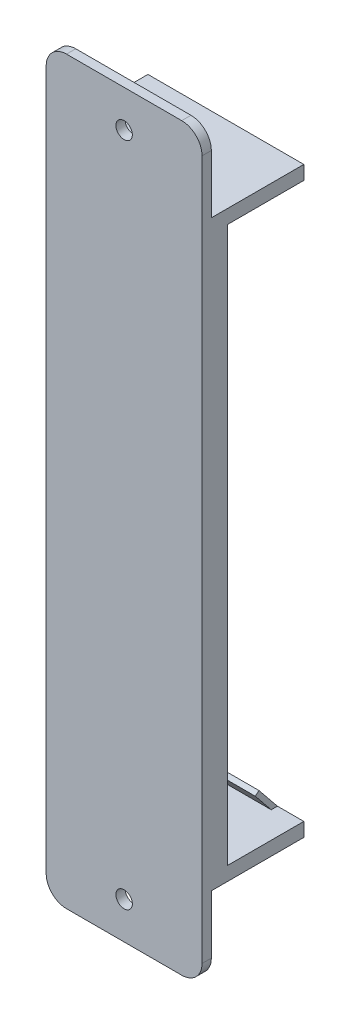
ISO-10303-21;
HEADER;
FILE_DESCRIPTION(('STEP AP214'),'2;1');
FILE_NAME('part.step','',(''),(''),'','','');
FILE_SCHEMA(('AUTOMOTIVE_DESIGN { 1 0 10303 214 1 1 1 1 }'));
ENDSEC;
DATA;
#1=APPLICATION_CONTEXT('core data for automotive mechanical design processes');
#2=APPLICATION_PROTOCOL_DEFINITION('international standard','automotive_design',2000,#1);
#3=PRODUCT_CONTEXT('',#1,'mechanical');
#4=PRODUCT('Part','Part','',(#3));
#5=PRODUCT_RELATED_PRODUCT_CATEGORY('part','',(#4));
#6=PRODUCT_DEFINITION_FORMATION('','',#4);
#7=PRODUCT_DEFINITION_CONTEXT('part definition',#1,'design');
#8=PRODUCT_DEFINITION('design','',#6,#7);
#9=PRODUCT_DEFINITION_SHAPE('','',#8);
#10=(LENGTH_UNIT() NAMED_UNIT(*) SI_UNIT(.MILLI.,.METRE.));
#11=(NAMED_UNIT(*) PLANE_ANGLE_UNIT() SI_UNIT($,.RADIAN.));
#12=(NAMED_UNIT(*) SI_UNIT($,.STERADIAN.) SOLID_ANGLE_UNIT());
#13=UNCERTAINTY_MEASURE_WITH_UNIT(LENGTH_MEASURE(1.E-05),#10,'distance_accuracy_value','');
#14=(GEOMETRIC_REPRESENTATION_CONTEXT(3) GLOBAL_UNCERTAINTY_ASSIGNED_CONTEXT((#13)) GLOBAL_UNIT_ASSIGNED_CONTEXT((#10,
#11,#12)) REPRESENTATION_CONTEXT('',''));
#15=CARTESIAN_POINT('',(0.,0.,0.));
#16=DIRECTION('',(0.,0.,1.));
#17=DIRECTION('',(1.,0.,0.));
#18=AXIS2_PLACEMENT_3D('',#15,#16,#17);
#19=CARTESIAN_POINT('',(-10.700385,12.7,0.));
#20=DIRECTION('',(1.,0.,0.));
#21=DIRECTION('',(0.,0.,-1.));
#22=AXIS2_PLACEMENT_3D('',#19,#20,#21);
#23=PLANE('',#22);
#24=DIRECTION('',(0.,-1.,0.));
#25=VECTOR('',#24,1.);
#26=CARTESIAN_POINT('',(-10.700385,12.7,10.700385));
#27=LINE('',#26,#25);
#28=CARTESIAN_POINT('',(-10.700385,-78.105,10.700385));
#29=VERTEX_POINT('',#28);
#30=CARTESIAN_POINT('',(-10.700385,-86.106,10.700385));
#31=VERTEX_POINT('',#30);
#32=EDGE_CURVE('E451',#29,#31,#27,.T.);
#33=ORIENTED_EDGE('',*,*,#32,.T.);
#34=DIRECTION('',(0.,0.,1.));
#35=VECTOR('',#34,1.);
#36=CARTESIAN_POINT('',(-10.700385,-86.106,0.));
#37=LINE('',#36,#35);
#38=CARTESIAN_POINT('',(-10.700385,-86.106,11.970385));
#39=VERTEX_POINT('',#38);
#40=EDGE_CURVE('E472',#31,#39,#37,.T.);
#41=ORIENTED_EDGE('',*,*,#40,.T.);
#42=DIRECTION('',(0.,-1.,0.));
#43=VECTOR('',#42,1.);
#44=CARTESIAN_POINT('',(-10.700385,12.7,11.970385));
#45=LINE('',#44,#43);
#46=CARTESIAN_POINT('',(-10.700385,9.906,11.970385));
#47=VERTEX_POINT('',#46);
#48=EDGE_CURVE('E447',#47,#39,#45,.T.);
#49=ORIENTED_EDGE('',*,*,#48,.F.);
#50=DIRECTION('',(0.,0.,1.));
#51=VECTOR('',#50,1.);
#52=CARTESIAN_POINT('',(-10.700385,9.906,10.700385));
#53=LINE('',#52,#51);
#54=CARTESIAN_POINT('',(-10.700385,9.906,10.700385));
#55=VERTEX_POINT('',#54);
#56=EDGE_CURVE('E463',#47,#55,#53,.F.);
#57=ORIENTED_EDGE('',*,*,#56,.T.);
#58=CARTESIAN_POINT('',(-10.700385,1.905,10.700385));
#59=VERTEX_POINT('',#58);
#60=EDGE_CURVE('E452',#55,#59,#27,.T.);
#61=ORIENTED_EDGE('',*,*,#60,.T.);
#62=DIRECTION('',(0.,0.,1.));
#63=VECTOR('',#62,1.);
#64=CARTESIAN_POINT('',(-10.700385,1.905,-1.999615));
#65=LINE('',#64,#63);
#66=CARTESIAN_POINT('',(-10.700385,1.905,-1.999615));
#67=VERTEX_POINT('',#66);
#68=EDGE_CURVE('E385',#67,#59,#65,.T.);
#69=ORIENTED_EDGE('',*,*,#68,.F.);
#70=DIRECTION('',(0.,1.,0.));
#71=VECTOR('',#70,1.);
#72=CARTESIAN_POINT('',(-10.700385,0.,-1.999615));
#73=LINE('',#72,#71);
#74=CARTESIAN_POINT('',(-10.700385,0.,-1.999615));
#75=VERTEX_POINT('',#74);
#76=EDGE_CURVE('E372',#75,#67,#73,.T.);
#77=ORIENTED_EDGE('',*,*,#76,.F.);
#78=DIRECTION('',(0.,0.,1.));
#79=VECTOR('',#78,1.);
#80=CARTESIAN_POINT('',(-10.700385,0.,-1.999615));
#81=LINE('',#80,#79);
#82=CARTESIAN_POINT('',(-10.700385,0.,8.45971601406342));
#83=VERTEX_POINT('',#82);
#84=EDGE_CURVE('E389',#75,#83,#81,.T.);
#85=ORIENTED_EDGE('',*,*,#84,.T.);
#86=DIRECTION('',(0.,1.,0.));
#87=VECTOR('',#86,1.);
#88=CARTESIAN_POINT('',(-10.700385,-76.2,8.45971601406342));
#89=LINE('',#88,#87);
#90=CARTESIAN_POINT('',(-10.700385,-76.2,8.45971601406342));
#91=VERTEX_POINT('',#90);
#92=EDGE_CURVE('E427',#91,#83,#89,.T.);
#93=ORIENTED_EDGE('',*,*,#92,.F.);
#94=DIRECTION('',(0.,0.,1.));
#95=VECTOR('',#94,1.);
#96=CARTESIAN_POINT('',(-10.700385,-76.2,-1.999615));
#97=LINE('',#96,#95);
#98=CARTESIAN_POINT('',(-10.700385,-76.2,-1.999615));
#99=VERTEX_POINT('',#98);
#100=EDGE_CURVE('E354',#99,#91,#97,.T.);
#101=ORIENTED_EDGE('',*,*,#100,.F.);
#102=DIRECTION('',(0.,1.,0.));
#103=VECTOR('',#102,1.);
#104=CARTESIAN_POINT('',(-10.700385,-76.2,-1.999615));
#105=LINE('',#104,#103);
#106=CARTESIAN_POINT('',(-10.700385,-78.105,-1.999615));
#107=VERTEX_POINT('',#106);
#108=EDGE_CURVE('E341',#107,#99,#105,.T.);
#109=ORIENTED_EDGE('',*,*,#108,.F.);
#110=DIRECTION('',(0.,0.,1.));
#111=VECTOR('',#110,1.);
#112=CARTESIAN_POINT('',(-10.700385,-78.105,-1.999615));
#113=LINE('',#112,#111);
#114=EDGE_CURVE('E357',#107,#29,#113,.T.);
#115=ORIENTED_EDGE('',*,*,#114,.T.);
#116=EDGE_LOOP('',(#33,#41,#49,#57,#61,#69,#77,#85,#93,#101,#109,#115));
#117=FACE_BOUND('',#116,.T.);
#118=ADVANCED_FACE('F77',(#117),#23,.F.);
#119=CARTESIAN_POINT('',(7.079615,-29.6007715383817,36.5717491689065));
#120=DIRECTION('',(0.,0.629134924444677,-0.777296112716377));
#121=DIRECTION('',(0.,0.777296112716377,0.629134924444677));
#122=AXIS2_PLACEMENT_3D('',#119,#120,#121);
#123=PLANE('',#122);
#124=DIRECTION('',(0.,-0.777296112716377,-0.629134924444677));
#125=VECTOR('',#124,1.);
#126=CARTESIAN_POINT('',(-7.144385,-29.6007715383817,36.5717491689065));
#127=LINE('',#126,#125);
#128=CARTESIAN_POINT('',(-7.144385,-73.4918648603631,1.04678097574282));
#129=VERTEX_POINT('',#128);
#130=CARTESIAN_POINT('',(-7.144385,-76.2,-1.14515382051818));
#131=VERTEX_POINT('',#130);
#132=EDGE_CURVE('E257',#129,#131,#127,.T.);
#133=ORIENTED_EDGE('',*,*,#132,.T.);
#134=DIRECTION('',(-1.,0.,0.));
#135=VECTOR('',#134,1.);
#136=CARTESIAN_POINT('',(7.079615,-76.2,-1.14515382051818));
#137=LINE('',#136,#135);
#138=CARTESIAN_POINT('',(7.079615,-76.2,-1.14515382051818));
#139=VERTEX_POINT('',#138);
#140=EDGE_CURVE('E278',#139,#131,#137,.T.);
#141=ORIENTED_EDGE('',*,*,#140,.F.);
#142=DIRECTION('',(0.,-0.777296112716377,-0.629134924444677));
#143=VECTOR('',#142,1.);
#144=CARTESIAN_POINT('',(7.079615,-29.6007715383817,36.5717491689065));
#145=LINE('',#144,#143);
#146=CARTESIAN_POINT('',(7.079615,-73.4918648603631,1.04678097574282));
#147=VERTEX_POINT('',#146);
#148=EDGE_CURVE('E578',#147,#139,#145,.T.);
#149=ORIENTED_EDGE('',*,*,#148,.F.);
#150=DIRECTION('',(-1.,0.,0.));
#151=VECTOR('',#150,1.);
#152=CARTESIAN_POINT('',(7.079615,-73.4918648603631,1.04678097574282));
#153=LINE('',#152,#151);
#154=EDGE_CURVE('E279',#147,#129,#153,.T.);
#155=ORIENTED_EDGE('',*,*,#154,.T.);
#156=EDGE_LOOP('',(#133,#141,#149,#155));
#157=FACE_BOUND('',#156,.T.);
#158=ADVANCED_FACE('F593',(#157),#123,.F.);
#159=CARTESIAN_POINT('',(7.079615,-29.1829194024886,36.055492912418));
#160=DIRECTION('',(0.,-0.629134924444678,0.777296112716376));
#161=DIRECTION('',(0.,-0.777296112716376,-0.629134924444678));
#162=AXIS2_PLACEMENT_3D('',#159,#160,#161);
#163=PLANE('',#162);
#164=DIRECTION('',(0.,0.777296112716376,0.629134924444678));
#165=VECTOR('',#164,1.);
#166=CARTESIAN_POINT('',(-7.144385,-29.1829194024886,36.055492912418));
#167=LINE('',#166,#165);
#168=CARTESIAN_POINT('',(-7.144385,-76.2,-1.999615));
#169=VERTEX_POINT('',#168);
#170=CARTESIAN_POINT('',(-7.144385,-73.0740127244699,0.530524719254272));
#171=VERTEX_POINT('',#170);
#172=EDGE_CURVE('E254',#169,#171,#167,.T.);
#173=ORIENTED_EDGE('',*,*,#172,.T.);
#174=DIRECTION('',(-1.,0.,0.));
#175=VECTOR('',#174,1.);
#176=CARTESIAN_POINT('',(7.079615,-73.0740127244699,0.530524719254272));
#177=LINE('',#176,#175);
#178=CARTESIAN_POINT('',(7.079615,-73.0740127244699,0.530524719254272));
#179=VERTEX_POINT('',#178);
#180=EDGE_CURVE('E268',#179,#171,#177,.T.);
#181=ORIENTED_EDGE('',*,*,#180,.F.);
#182=DIRECTION('',(0.,0.777296112716376,0.629134924444678));
#183=VECTOR('',#182,1.);
#184=CARTESIAN_POINT('',(7.079615,-29.1829194024886,36.055492912418));
#185=LINE('',#184,#183);
#186=CARTESIAN_POINT('',(7.079615,-76.2,-1.999615));
#187=VERTEX_POINT('',#186);
#188=EDGE_CURVE('E585',#187,#179,#185,.T.);
#189=ORIENTED_EDGE('',*,*,#188,.F.);
#190=DIRECTION('',(1.,0.,0.));
#191=VECTOR('',#190,1.);
#192=CARTESIAN_POINT('',(10.700385,-76.2,-1.999615));
#193=LINE('',#192,#191);
#194=EDGE_CURVE('E270',#169,#187,#193,.T.);
#195=ORIENTED_EDGE('',*,*,#194,.F.);
#196=EDGE_LOOP('',(#173,#181,#189,#195));
#197=FACE_BOUND('',#196,.T.);
#198=ADVANCED_FACE('F266',(#197),#163,.F.);
#199=CARTESIAN_POINT('',(7.079615,-43.8910933219814,-35.5249681931637));
#200=DIRECTION('',(0.,-0.777296112716376,-0.629134924444678));
#201=DIRECTION('',(0.,0.629134924444678,-0.777296112716376));
#202=AXIS2_PLACEMENT_3D('',#199,#200,#201);
#203=PLANE('',#202);
#204=DIRECTION('',(0.,-0.629134924444678,0.777296112716376));
#205=VECTOR('',#204,1.);
#206=CARTESIAN_POINT('',(-7.144385,-43.8910933219814,-35.5249681931637));
#207=LINE('',#206,#205);
#208=EDGE_CURVE('E251',#171,#129,#207,.T.);
#209=ORIENTED_EDGE('',*,*,#208,.T.);
#210=ORIENTED_EDGE('',*,*,#154,.F.);
#211=DIRECTION('',(0.,-0.629134924444678,0.777296112716376));
#212=VECTOR('',#211,1.);
#213=CARTESIAN_POINT('',(7.079615,-43.8910933219814,-35.5249681931637));
#214=LINE('',#213,#212);
#215=EDGE_CURVE('E276',#179,#147,#214,.T.);
#216=ORIENTED_EDGE('',*,*,#215,.F.);
#217=ORIENTED_EDGE('',*,*,#180,.T.);
#218=EDGE_LOOP('',(#209,#210,#216,#217));
#219=FACE_BOUND('',#218,.T.);
#220=ADVANCED_FACE('F275',(#219),#203,.F.);
#221=CARTESIAN_POINT('',(10.700385,-76.2,-1.999615));
#222=DIRECTION('',(0.,-1.,0.));
#223=DIRECTION('',(0.,0.,-1.));
#224=AXIS2_PLACEMENT_3D('',#221,#222,#223);
#225=PLANE('',#224);
#226=ORIENTED_EDGE('',*,*,#140,.T.);
#227=DIRECTION('',(0.,0.,-1.));
#228=VECTOR('',#227,1.);
#229=CARTESIAN_POINT('',(-7.144385,-76.2,0.));
#230=LINE('',#229,#228);
#231=EDGE_CURVE('E273',#131,#169,#230,.T.);
#232=ORIENTED_EDGE('',*,*,#231,.T.);
#233=EDGE_CURVE('E346',#99,#169,#193,.T.);
#234=ORIENTED_EDGE('',*,*,#233,.F.);
#235=ORIENTED_EDGE('',*,*,#100,.T.);
#236=DIRECTION('',(-1.,0.,0.));
#237=VECTOR('',#236,1.);
#238=CARTESIAN_POINT('',(0.,-76.2,8.45971601406342));
#239=LINE('',#238,#237);
#240=CARTESIAN_POINT('',(-6.55220910148813,-76.2,8.45971601406342));
#241=VERTEX_POINT('',#240);
#242=EDGE_CURVE('E416',#241,#91,#239,.T.);
#243=ORIENTED_EDGE('',*,*,#242,.F.);
#244=CARTESIAN_POINT('',(0.,-76.2,0.));
#245=DIRECTION('',(0.,1.,0.));
#246=DIRECTION('',(0.,0.,1.));
#247=AXIS2_PLACEMENT_3D('',#244,#245,#246);
#248=CIRCLE('',#247,10.700385);
#249=CARTESIAN_POINT('',(6.55220910148813,-76.2,8.45971601406342));
#250=VERTEX_POINT('',#249);
#251=EDGE_CURVE('E413',#241,#250,#248,.T.);
#252=ORIENTED_EDGE('',*,*,#251,.T.);
#253=DIRECTION('',(-1.,0.,0.));
#254=VECTOR('',#253,1.);
#255=CARTESIAN_POINT('',(0.,-76.2,8.45971601406342));
#256=LINE('',#255,#254);
#257=CARTESIAN_POINT('',(10.700385,-76.2,8.45971601406342));
#258=VERTEX_POINT('',#257);
#259=EDGE_CURVE('E396',#258,#250,#256,.T.);
#260=ORIENTED_EDGE('',*,*,#259,.F.);
#261=DIRECTION('',(0.,0.,1.));
#262=VECTOR('',#261,1.);
#263=CARTESIAN_POINT('',(10.700385,-76.2,-1.999615));
#264=LINE('',#263,#262);
#265=CARTESIAN_POINT('',(10.700385,-76.2,-1.999615));
#266=VERTEX_POINT('',#265);
#267=EDGE_CURVE('E349',#266,#258,#264,.T.);
#268=ORIENTED_EDGE('',*,*,#267,.F.);
#269=EDGE_CURVE('E345',#187,#266,#193,.T.);
#270=ORIENTED_EDGE('',*,*,#269,.F.);
#271=DIRECTION('',(0.,0.,-1.));
#272=VECTOR('',#271,1.);
#273=CARTESIAN_POINT('',(7.079615,-76.2,0.));
#274=LINE('',#273,#272);
#275=EDGE_CURVE('E286',#139,#187,#274,.T.);
#276=ORIENTED_EDGE('',*,*,#275,.F.);
#277=EDGE_LOOP('',(#226,#232,#234,#235,#243,#252,#260,#268,#270,#276));
#278=FACE_BOUND('',#277,.T.);
#279=ADVANCED_FACE('F568',(#278),#225,.F.);
#280=CARTESIAN_POINT('',(10.700385,12.7,0.));
#281=DIRECTION('',(-1.,0.,0.));
#282=DIRECTION('',(0.,0.,1.));
#283=AXIS2_PLACEMENT_3D('',#280,#281,#282);
#284=PLANE('',#283);
#285=DIRECTION('',(0.,-1.,0.));
#286=VECTOR('',#285,1.);
#287=CARTESIAN_POINT('',(10.700385,12.7,11.970385));
#288=LINE('',#287,#286);
#289=CARTESIAN_POINT('',(10.700385,9.906,11.970385));
#290=VERTEX_POINT('',#289);
#291=CARTESIAN_POINT('',(10.700385,-86.106,11.970385));
#292=VERTEX_POINT('',#291);
#293=EDGE_CURVE('E459',#290,#292,#288,.T.);
#294=ORIENTED_EDGE('',*,*,#293,.T.);
#295=DIRECTION('',(0.,0.,-1.));
#296=VECTOR('',#295,1.);
#297=CARTESIAN_POINT('',(10.700385,-86.106,0.));
#298=LINE('',#297,#296);
#299=CARTESIAN_POINT('',(10.700385,-86.106,10.700385));
#300=VERTEX_POINT('',#299);
#301=EDGE_CURVE('E503',#292,#300,#298,.T.);
#302=ORIENTED_EDGE('',*,*,#301,.T.);
#303=DIRECTION('',(0.,-1.,0.));
#304=VECTOR('',#303,1.);
#305=CARTESIAN_POINT('',(10.700385,12.7,10.700385));
#306=LINE('',#305,#304);
#307=CARTESIAN_POINT('',(10.700385,-78.105,10.700385));
#308=VERTEX_POINT('',#307);
#309=EDGE_CURVE('E455',#308,#300,#306,.T.);
#310=ORIENTED_EDGE('',*,*,#309,.F.);
#311=DIRECTION('',(0.,0.,1.));
#312=VECTOR('',#311,1.);
#313=CARTESIAN_POINT('',(10.700385,-78.105,-1.999615));
#314=LINE('',#313,#312);
#315=CARTESIAN_POINT('',(10.700385,-78.105,-1.999615));
#316=VERTEX_POINT('',#315);
#317=EDGE_CURVE('E361',#316,#308,#314,.T.);
#318=ORIENTED_EDGE('',*,*,#317,.F.);
#319=DIRECTION('',(0.,-1.,0.));
#320=VECTOR('',#319,1.);
#321=CARTESIAN_POINT('',(10.700385,-78.105,-1.999615));
#322=LINE('',#321,#320);
#323=EDGE_CURVE('E334',#266,#316,#322,.T.);
#324=ORIENTED_EDGE('',*,*,#323,.F.);
#325=ORIENTED_EDGE('',*,*,#267,.T.);
#326=DIRECTION('',(0.,1.,0.));
#327=VECTOR('',#326,1.);
#328=CARTESIAN_POINT('',(10.700385,-76.2,8.45971601406342));
#329=LINE('',#328,#327);
#330=CARTESIAN_POINT('',(10.700385,0.,8.45971601406342));
#331=VERTEX_POINT('',#330);
#332=EDGE_CURVE('E397',#258,#331,#329,.T.);
#333=ORIENTED_EDGE('',*,*,#332,.T.);
#334=DIRECTION('',(0.,0.,1.));
#335=VECTOR('',#334,1.);
#336=CARTESIAN_POINT('',(10.700385,0.,-1.999615));
#337=LINE('',#336,#335);
#338=CARTESIAN_POINT('',(10.700385,0.,-1.999615));
#339=VERTEX_POINT('',#338);
#340=EDGE_CURVE('E393',#339,#331,#337,.T.);
#341=ORIENTED_EDGE('',*,*,#340,.F.);
#342=DIRECTION('',(0.,-1.,0.));
#343=VECTOR('',#342,1.);
#344=CARTESIAN_POINT('',(10.700385,1.905,-1.999615));
#345=LINE('',#344,#343);
#346=CARTESIAN_POINT('',(10.700385,1.905,-1.999615));
#347=VERTEX_POINT('',#346);
#348=EDGE_CURVE('E365',#347,#339,#345,.T.);
#349=ORIENTED_EDGE('',*,*,#348,.F.);
#350=DIRECTION('',(0.,0.,1.));
#351=VECTOR('',#350,1.);
#352=CARTESIAN_POINT('',(10.700385,1.905,-1.999615));
#353=LINE('',#352,#351);
#354=CARTESIAN_POINT('',(10.700385,1.905,10.700385));
#355=VERTEX_POINT('',#354);
#356=EDGE_CURVE('E378',#347,#355,#353,.T.);
#357=ORIENTED_EDGE('',*,*,#356,.T.);
#358=CARTESIAN_POINT('',(10.700385,9.906,10.700385));
#359=VERTEX_POINT('',#358);
#360=EDGE_CURVE('E456',#359,#355,#306,.T.);
#361=ORIENTED_EDGE('',*,*,#360,.F.);
#362=DIRECTION('',(0.,0.,-1.));
#363=VECTOR('',#362,1.);
#364=CARTESIAN_POINT('',(10.700385,9.906,11.970385));
#365=LINE('',#364,#363);
#366=EDGE_CURVE('E500',#359,#290,#365,.F.);
#367=ORIENTED_EDGE('',*,*,#366,.T.);
#368=EDGE_LOOP('',(#294,#302,#310,#318,#324,#325,#333,#341,#349,#357,#361,#367));
#369=FACE_BOUND('',#368,.T.);
#370=ADVANCED_FACE('F518',(#369),#284,.F.);
#371=CARTESIAN_POINT('',(-7.079615,-0.340326639448789,-0.340326639448795));
#372=DIRECTION('',(0.,0.707106781186541,0.707106781186553));
#373=DIRECTION('',(0.,-0.707106781186554,0.707106781186541));
#374=AXIS2_PLACEMENT_3D('',#371,#372,#373);
#375=PLANE('',#374);
#376=DIRECTION('',(1.,0.,0.));
#377=VECTOR('',#376,1.);
#378=CARTESIAN_POINT('',(-7.079615,-2.65172736552564,1.97107408662802));
#379=LINE('',#378,#377);
#380=CARTESIAN_POINT('',(-7.079615,-2.65172736552564,1.97107408662802));
#381=VERTEX_POINT('',#380);
#382=CARTESIAN_POINT('',(7.144385,-2.65172736552564,1.97107408662802));
#383=VERTEX_POINT('',#382);
#384=EDGE_CURVE('E317',#381,#383,#379,.T.);
#385=ORIENTED_EDGE('',*,*,#384,.T.);
#386=DIRECTION('',(0.,-0.707106781186554,0.707106781186541));
#387=VECTOR('',#386,1.);
#388=CARTESIAN_POINT('',(7.144385,-0.340326639448789,-0.340326639448795));
#389=LINE('',#388,#387);
#390=CARTESIAN_POINT('',(7.144385,0.,-0.680653278897578));
#391=VERTEX_POINT('',#390);
#392=EDGE_CURVE('E284',#391,#383,#389,.T.);
#393=ORIENTED_EDGE('',*,*,#392,.F.);
#394=DIRECTION('',(1.,0.,0.));
#395=VECTOR('',#394,1.);
#396=CARTESIAN_POINT('',(-7.079615,0.,-0.680653278897578));
#397=LINE('',#396,#395);
#398=CARTESIAN_POINT('',(-7.079615,0.,-0.680653278897578));
#399=VERTEX_POINT('',#398);
#400=EDGE_CURVE('E318',#399,#391,#397,.T.);
#401=ORIENTED_EDGE('',*,*,#400,.F.);
#402=DIRECTION('',(0.,-0.707106781186554,0.707106781186541));
#403=VECTOR('',#402,1.);
#404=CARTESIAN_POINT('',(-7.079615,-0.340326639448789,-0.340326639448795));
#405=LINE('',#404,#403);
#406=EDGE_CURVE('E302',#399,#381,#405,.T.);
#407=ORIENTED_EDGE('',*,*,#406,.T.);
#408=EDGE_LOOP('',(#385,#393,#401,#407));
#409=FACE_BOUND('',#408,.T.);
#410=ADVANCED_FACE('F666',(#409),#375,.T.);
#411=CARTESIAN_POINT('',(-7.079615,-0.990876376660425,-0.990876376660442));
#412=DIRECTION('',(0.,0.707106781186541,0.707106781186553));
#413=DIRECTION('',(0.,-0.707106781186554,0.707106781186541));
#414=AXIS2_PLACEMENT_3D('',#411,#412,#413);
#415=PLANE('',#414);
#416=DIRECTION('',(0.,-0.707106781186554,0.707106781186541));
#417=VECTOR('',#416,1.);
#418=CARTESIAN_POINT('',(7.144385,-0.990876376660425,-0.990876376660442));
#419=LINE('',#418,#417);
#420=CARTESIAN_POINT('',(7.144385,0.,-1.98175275332085));
#421=VERTEX_POINT('',#420);
#422=CARTESIAN_POINT('',(7.144385,-3.18610750680663,1.20435475348573));
#423=VERTEX_POINT('',#422);
#424=EDGE_CURVE('E295',#421,#423,#419,.T.);
#425=ORIENTED_EDGE('',*,*,#424,.T.);
#426=DIRECTION('',(1.,0.,0.));
#427=VECTOR('',#426,1.);
#428=CARTESIAN_POINT('',(-7.079615,-3.18610750680663,1.20435475348573));
#429=LINE('',#428,#427);
#430=CARTESIAN_POINT('',(-7.079615,-3.18610750680663,1.20435475348573));
#431=VERTEX_POINT('',#430);
#432=EDGE_CURVE('E327',#431,#423,#429,.T.);
#433=ORIENTED_EDGE('',*,*,#432,.F.);
#434=DIRECTION('',(0.,-0.707106781186554,0.707106781186541));
#435=VECTOR('',#434,1.);
#436=CARTESIAN_POINT('',(-7.079615,-0.990876376660425,-0.990876376660442));
#437=LINE('',#436,#435);
#438=CARTESIAN_POINT('',(-7.079615,0.,-1.98175275332085));
#439=VERTEX_POINT('',#438);
#440=EDGE_CURVE('E310',#439,#431,#437,.T.);
#441=ORIENTED_EDGE('',*,*,#440,.F.);
#442=DIRECTION('',(1.,0.,0.));
#443=VECTOR('',#442,1.);
#444=CARTESIAN_POINT('',(-7.079615,0.,-1.98175275332085));
#445=LINE('',#444,#443);
#446=EDGE_CURVE('E323',#439,#421,#445,.T.);
#447=ORIENTED_EDGE('',*,*,#446,.T.);
#448=EDGE_LOOP('',(#425,#433,#441,#447));
#449=FACE_BOUND('',#448,.T.);
#450=ADVANCED_FACE('F669',(#449),#415,.F.);
#451=CARTESIAN_POINT('',(-7.079615,-2.70937968653158,1.88835553909776));
#452=DIRECTION('',(0.,-0.820398166769988,0.57179266168817));
#453=DIRECTION('',(0.,-0.57179266168817,-0.820398166769988));
#454=AXIS2_PLACEMENT_3D('',#451,#452,#453);
#455=PLANE('',#454);
#456=ORIENTED_EDGE('',*,*,#432,.T.);
#457=DIRECTION('',(0.,-0.57179266168817,-0.820398166769988));
#458=VECTOR('',#457,1.);
#459=CARTESIAN_POINT('',(7.144385,-2.70937968653158,1.88835553909776));
#460=LINE('',#459,#458);
#461=EDGE_CURVE('E292',#383,#423,#460,.T.);
#462=ORIENTED_EDGE('',*,*,#461,.F.);
#463=ORIENTED_EDGE('',*,*,#384,.F.);
#464=DIRECTION('',(0.,-0.57179266168817,-0.820398166769988));
#465=VECTOR('',#464,1.);
#466=CARTESIAN_POINT('',(-7.079615,-2.70937968653158,1.88835553909776));
#467=LINE('',#466,#465);
#468=EDGE_CURVE('E306',#381,#431,#467,.T.);
#469=ORIENTED_EDGE('',*,*,#468,.T.);
#470=EDGE_LOOP('',(#456,#462,#463,#469));
#471=FACE_BOUND('',#470,.T.);
#472=ADVANCED_FACE('F619',(#471),#455,.T.);
#473=CARTESIAN_POINT('',(0.,12.7,10.700385));
#474=DIRECTION('',(0.,0.,-1.));
#475=DIRECTION('',(-1.,0.,0.));
#476=AXIS2_PLACEMENT_3D('',#473,#474,#475);
#477=PLANE('',#476);
#478=CARTESIAN_POINT('',(0.,-83.82,10.700385));
#479=DIRECTION('',(0.,0.,-1.));
#480=DIRECTION('',(-1.,0.,0.));
#481=AXIS2_PLACEMENT_3D('',#478,#479,#480);
#482=CIRCLE('',#481,1.1303);
#483=CARTESIAN_POINT('',(-1.1303,-83.82,10.700385));
#484=VERTEX_POINT('',#483);
#485=EDGE_CURVE('E468',#484,#484,#482,.T.);
#486=ORIENTED_EDGE('',*,*,#485,.F.);
#487=EDGE_LOOP('',(#486));
#488=FACE_BOUND('',#487,.T.);
#489=DIRECTION('',(1.,0.,0.));
#490=VECTOR('',#489,1.);
#491=CARTESIAN_POINT('',(0.,-88.9,10.700385));
#492=LINE('',#491,#490);
#493=CARTESIAN_POINT('',(-7.906385,-88.9,10.700385));
#494=VERTEX_POINT('',#493);
#495=CARTESIAN_POINT('',(7.906385,-88.9,10.700385));
#496=VERTEX_POINT('',#495);
#497=EDGE_CURVE('E436',#494,#496,#492,.T.);
#498=ORIENTED_EDGE('',*,*,#497,.F.);
#499=CARTESIAN_POINT('',(-7.906385,-86.106,10.700385));
#500=DIRECTION('',(0.,0.,-1.));
#501=DIRECTION('',(-1.,0.,0.));
#502=AXIS2_PLACEMENT_3D('',#499,#500,#501);
#503=CIRCLE('',#502,2.794);
#504=EDGE_CURVE('E497',#494,#31,#503,.T.);
#505=ORIENTED_EDGE('',*,*,#504,.T.);
#506=ORIENTED_EDGE('',*,*,#32,.F.);
#507=DIRECTION('',(-1.,0.,0.));
#508=VECTOR('',#507,1.);
#509=CARTESIAN_POINT('',(-10.700385,-78.105,10.700385));
#510=LINE('',#509,#508);
#511=EDGE_CURVE('E322',#308,#29,#510,.T.);
#512=ORIENTED_EDGE('',*,*,#511,.F.);
#513=ORIENTED_EDGE('',*,*,#309,.T.);
#514=CARTESIAN_POINT('',(7.906385,-86.106,10.700385));
#515=DIRECTION('',(0.,0.,-1.));
#516=DIRECTION('',(-1.,0.,0.));
#517=AXIS2_PLACEMENT_3D('',#514,#515,#516);
#518=CIRCLE('',#517,2.794);
#519=EDGE_CURVE('E494',#300,#496,#518,.T.);
#520=ORIENTED_EDGE('',*,*,#519,.T.);
#521=EDGE_LOOP('',(#498,#505,#506,#512,#513,#520));
#522=FACE_BOUND('',#521,.T.);
#523=ADVANCED_FACE('F555',(#488,#522),#477,.T.);
#524=CARTESIAN_POINT('',(0.,7.62,10.700385));
#525=DIRECTION('',(0.,0.,-1.));
#526=DIRECTION('',(-1.,0.,0.));
#527=AXIS2_PLACEMENT_3D('',#524,#525,#526);
#528=CIRCLE('',#527,1.1303);
#529=CARTESIAN_POINT('',(-1.1303,7.62,10.700385));
#530=VERTEX_POINT('',#529);
#531=EDGE_CURVE('E469',#530,#530,#528,.T.);
#532=ORIENTED_EDGE('',*,*,#531,.F.);
#533=EDGE_LOOP('',(#532));
#534=FACE_BOUND('',#533,.T.);
#535=ORIENTED_EDGE('',*,*,#60,.F.);
#536=CARTESIAN_POINT('',(-7.906385,9.906,10.700385));
#537=DIRECTION('',(0.,0.,-1.));
#538=DIRECTION('',(-1.,0.,0.));
#539=AXIS2_PLACEMENT_3D('',#536,#537,#538);
#540=CIRCLE('',#539,2.794);
#541=CARTESIAN_POINT('',(-7.906385,12.7,10.700385));
#542=VERTEX_POINT('',#541);
#543=EDGE_CURVE('E12',#55,#542,#540,.T.);
#544=ORIENTED_EDGE('',*,*,#543,.T.);
#545=DIRECTION('',(1.,0.,0.));
#546=VECTOR('',#545,1.);
#547=CARTESIAN_POINT('',(0.,12.7,10.700385));
#548=LINE('',#547,#546);
#549=CARTESIAN_POINT('',(7.906385,12.7,10.700385));
#550=VERTEX_POINT('',#549);
#551=EDGE_CURVE('E444',#542,#550,#548,.T.);
#552=ORIENTED_EDGE('',*,*,#551,.T.);
#553=CARTESIAN_POINT('',(7.906385,9.906,10.700385));
#554=DIRECTION('',(0.,0.,-1.));
#555=DIRECTION('',(-1.,0.,0.));
#556=AXIS2_PLACEMENT_3D('',#553,#554,#555);
#557=CIRCLE('',#556,2.794);
#558=EDGE_CURVE('E86',#550,#359,#557,.T.);
#559=ORIENTED_EDGE('',*,*,#558,.T.);
#560=ORIENTED_EDGE('',*,*,#360,.T.);
#561=DIRECTION('',(1.,0.,0.));
#562=VECTOR('',#561,1.);
#563=CARTESIAN_POINT('',(-10.700385,1.905,10.700385));
#564=LINE('',#563,#562);
#565=EDGE_CURVE('E364',#59,#355,#564,.T.);
#566=ORIENTED_EDGE('',*,*,#565,.F.);
#567=EDGE_LOOP('',(#535,#544,#552,#559,#560,#566));
#568=FACE_BOUND('',#567,.T.);
#569=ADVANCED_FACE('F515',(#534,#568),#477,.T.);
#570=CARTESIAN_POINT('',(0.,12.7,11.970385));
#571=DIRECTION('',(0.,0.,-1.));
#572=DIRECTION('',(-1.,0.,0.));
#573=AXIS2_PLACEMENT_3D('',#570,#571,#572);
#574=PLANE('',#573);
#575=CARTESIAN_POINT('',(0.,7.62,11.970385));
#576=DIRECTION('',(0.,0.,-1.));
#577=DIRECTION('',(-1.,0.,0.));
#578=AXIS2_PLACEMENT_3D('',#575,#576,#577);
#579=CIRCLE('',#578,1.1303);
#580=CARTESIAN_POINT('',(-1.1303,7.62,11.970385));
#581=VERTEX_POINT('',#580);
#582=EDGE_CURVE('E464',#581,#581,#579,.T.);
#583=ORIENTED_EDGE('',*,*,#582,.T.);
#584=EDGE_LOOP('',(#583));
#585=FACE_BOUND('',#584,.T.);
#586=CARTESIAN_POINT('',(0.,-83.82,11.970385));
#587=DIRECTION('',(0.,0.,-1.));
#588=DIRECTION('',(-1.,0.,0.));
#589=AXIS2_PLACEMENT_3D('',#586,#587,#588);
#590=CIRCLE('',#589,1.1303);
#591=CARTESIAN_POINT('',(-1.1303,-83.82,11.970385));
#592=VERTEX_POINT('',#591);
#593=EDGE_CURVE('E595',#592,#592,#590,.T.);
#594=ORIENTED_EDGE('',*,*,#593,.T.);
#595=EDGE_LOOP('',(#594));
#596=FACE_BOUND('',#595,.T.);
#597=ORIENTED_EDGE('',*,*,#48,.T.);
#598=CARTESIAN_POINT('',(-7.906385,-86.106,11.970385));
#599=DIRECTION('',(0.,0.,-1.));
#600=DIRECTION('',(-1.,0.,0.));
#601=AXIS2_PLACEMENT_3D('',#598,#599,#600);
#602=CIRCLE('',#601,2.794);
#603=CARTESIAN_POINT('',(-7.906385,-88.9,11.970385));
#604=VERTEX_POINT('',#603);
#605=EDGE_CURVE('E485',#39,#604,#602,.F.);
#606=ORIENTED_EDGE('',*,*,#605,.T.);
#607=DIRECTION('',(1.,0.,0.));
#608=VECTOR('',#607,1.);
#609=CARTESIAN_POINT('',(0.,-88.9,11.970385));
#610=LINE('',#609,#608);
#611=CARTESIAN_POINT('',(7.906385,-88.9,11.970385));
#612=VERTEX_POINT('',#611);
#613=EDGE_CURVE('E430',#604,#612,#610,.T.);
#614=ORIENTED_EDGE('',*,*,#613,.T.);
#615=CARTESIAN_POINT('',(7.906385,-86.106,11.970385));
#616=DIRECTION('',(0.,0.,-1.));
#617=DIRECTION('',(-1.,0.,0.));
#618=AXIS2_PLACEMENT_3D('',#615,#616,#617);
#619=CIRCLE('',#618,2.794);
#620=EDGE_CURVE('E482',#612,#292,#619,.F.);
#621=ORIENTED_EDGE('',*,*,#620,.T.);
#622=ORIENTED_EDGE('',*,*,#293,.F.);
#623=CARTESIAN_POINT('',(7.906385,9.906,11.970385));
#624=DIRECTION('',(0.,0.,-1.));
#625=DIRECTION('',(-1.,0.,0.));
#626=AXIS2_PLACEMENT_3D('',#623,#624,#625);
#627=CIRCLE('',#626,2.794);
#628=CARTESIAN_POINT('',(7.906385,12.7,11.970385));
#629=VERTEX_POINT('',#628);
#630=EDGE_CURVE('E476',#290,#629,#627,.F.);
#631=ORIENTED_EDGE('',*,*,#630,.T.);
#632=DIRECTION('',(1.,0.,0.));
#633=VECTOR('',#632,1.);
#634=CARTESIAN_POINT('',(0.,12.7,11.970385));
#635=LINE('',#634,#633);
#636=CARTESIAN_POINT('',(-7.906385,12.7,11.970385));
#637=VERTEX_POINT('',#636);
#638=EDGE_CURVE('E440',#637,#629,#635,.T.);
#639=ORIENTED_EDGE('',*,*,#638,.F.);
#640=CARTESIAN_POINT('',(-7.906385,9.906,11.970385));
#641=DIRECTION('',(0.,0.,-1.));
#642=DIRECTION('',(-1.,0.,0.));
#643=AXIS2_PLACEMENT_3D('',#640,#641,#642);
#644=CIRCLE('',#643,2.794);
#645=EDGE_CURVE('E479',#637,#47,#644,.F.);
#646=ORIENTED_EDGE('',*,*,#645,.T.);
#647=EDGE_LOOP('',(#597,#606,#614,#621,#622,#631,#639,#646));
#648=FACE_BOUND('',#647,.T.);
#649=ADVANCED_FACE('F525',(#585,#596,#648),#574,.F.);
#650=CARTESIAN_POINT('',(0.,12.7,0.));
#651=DIRECTION('',(0.,1.,0.));
#652=DIRECTION('',(0.,0.,1.));
#653=AXIS2_PLACEMENT_3D('',#650,#651,#652);
#654=PLANE('',#653);
#655=ORIENTED_EDGE('',*,*,#551,.F.);
#656=DIRECTION('',(0.,0.,1.));
#657=VECTOR('',#656,1.);
#658=CARTESIAN_POINT('',(-7.906385,12.7,11.970385));
#659=LINE('',#658,#657);
#660=EDGE_CURVE('E510',#542,#637,#659,.T.);
#661=ORIENTED_EDGE('',*,*,#660,.T.);
#662=ORIENTED_EDGE('',*,*,#638,.T.);
#663=DIRECTION('',(0.,0.,-1.));
#664=VECTOR('',#663,1.);
#665=CARTESIAN_POINT('',(7.906385,12.7,10.700385));
#666=LINE('',#665,#664);
#667=EDGE_CURVE('E507',#629,#550,#666,.T.);
#668=ORIENTED_EDGE('',*,*,#667,.T.);
#669=EDGE_LOOP('',(#655,#661,#662,#668));
#670=FACE_BOUND('',#669,.T.);
#671=ADVANCED_FACE('F527',(#670),#654,.T.);
#672=CARTESIAN_POINT('',(0.,-88.9,0.));
#673=DIRECTION('',(0.,1.,0.));
#674=DIRECTION('',(0.,0.,1.));
#675=AXIS2_PLACEMENT_3D('',#672,#673,#674);
#676=PLANE('',#675);
#677=ORIENTED_EDGE('',*,*,#613,.F.);
#678=DIRECTION('',(0.,0.,1.));
#679=VECTOR('',#678,1.);
#680=CARTESIAN_POINT('',(-7.906385,-88.9,0.));
#681=LINE('',#680,#679);
#682=EDGE_CURVE('E491',#604,#494,#681,.F.);
#683=ORIENTED_EDGE('',*,*,#682,.T.);
#684=ORIENTED_EDGE('',*,*,#497,.T.);
#685=DIRECTION('',(0.,0.,-1.));
#686=VECTOR('',#685,1.);
#687=CARTESIAN_POINT('',(7.906385,-88.9,0.));
#688=LINE('',#687,#686);
#689=EDGE_CURVE('E488',#496,#612,#688,.F.);
#690=ORIENTED_EDGE('',*,*,#689,.T.);
#691=EDGE_LOOP('',(#677,#683,#684,#690));
#692=FACE_BOUND('',#691,.T.);
#693=ADVANCED_FACE('F544',(#692),#676,.F.);
#694=CARTESIAN_POINT('',(0.,-76.2,0.));
#695=DIRECTION('',(0.,1.,0.));
#696=DIRECTION('',(0.,0.,1.));
#697=AXIS2_PLACEMENT_3D('',#694,#695,#696);
#698=CYLINDRICAL_SURFACE('',#697,10.700385);
#699=CARTESIAN_POINT('',(0.,0.,0.));
#700=DIRECTION('',(0.,1.,0.));
#701=DIRECTION('',(0.,0.,1.));
#702=AXIS2_PLACEMENT_3D('',#699,#700,#701);
#703=CIRCLE('',#702,10.700385);
#704=CARTESIAN_POINT('',(-6.55220910148813,0.,8.45971601406342));
#705=VERTEX_POINT('',#704);
#706=CARTESIAN_POINT('',(6.55220910148813,0.,8.45971601406342));
#707=VERTEX_POINT('',#706);
#708=EDGE_CURVE('E409',#705,#707,#703,.T.);
#709=ORIENTED_EDGE('',*,*,#708,.T.);
#710=DIRECTION('',(0.,1.,0.));
#711=VECTOR('',#710,1.);
#712=CARTESIAN_POINT('',(6.55220910148813,-76.2,8.45971601406342));
#713=LINE('',#712,#711);
#714=EDGE_CURVE('E402',#250,#707,#713,.T.);
#715=ORIENTED_EDGE('',*,*,#714,.F.);
#716=ORIENTED_EDGE('',*,*,#251,.F.);
#717=DIRECTION('',(0.,1.,0.));
#718=VECTOR('',#717,1.);
#719=CARTESIAN_POINT('',(-6.55220910148813,-76.2,8.45971601406342));
#720=LINE('',#719,#718);
#721=EDGE_CURVE('E421',#241,#705,#720,.T.);
#722=ORIENTED_EDGE('',*,*,#721,.T.);
#723=EDGE_LOOP('',(#709,#715,#716,#722));
#724=FACE_BOUND('',#723,.T.);
#725=ADVANCED_FACE('F635',(#724),#698,.F.);
#726=CARTESIAN_POINT('',(0.,-76.2,8.45971601406342));
#727=DIRECTION('',(0.,0.,-1.));
#728=DIRECTION('',(-1.,0.,0.));
#729=AXIS2_PLACEMENT_3D('',#726,#727,#728);
#730=PLANE('',#729);
#731=DIRECTION('',(-1.,0.,0.));
#732=VECTOR('',#731,1.);
#733=CARTESIAN_POINT('',(0.,0.,8.45971601406342));
#734=LINE('',#733,#732);
#735=EDGE_CURVE('E417',#705,#83,#734,.T.);
#736=ORIENTED_EDGE('',*,*,#735,.F.);
#737=ORIENTED_EDGE('',*,*,#721,.F.);
#738=ORIENTED_EDGE('',*,*,#242,.T.);
#739=ORIENTED_EDGE('',*,*,#92,.T.);
#740=EDGE_LOOP('',(#736,#737,#738,#739));
#741=FACE_BOUND('',#740,.T.);
#742=ADVANCED_FACE('F638',(#741),#730,.T.);
#743=CARTESIAN_POINT('',(0.,-76.2,8.45971601406342));
#744=DIRECTION('',(0.,0.,-1.));
#745=DIRECTION('',(-1.,0.,0.));
#746=AXIS2_PLACEMENT_3D('',#743,#744,#745);
#747=PLANE('',#746);
#748=DIRECTION('',(-1.,0.,0.));
#749=VECTOR('',#748,1.);
#750=CARTESIAN_POINT('',(0.,0.,8.45971601406342));
#751=LINE('',#750,#749);
#752=EDGE_CURVE('E401',#331,#707,#751,.T.);
#753=ORIENTED_EDGE('',*,*,#752,.F.);
#754=ORIENTED_EDGE('',*,*,#332,.F.);
#755=ORIENTED_EDGE('',*,*,#259,.T.);
#756=ORIENTED_EDGE('',*,*,#714,.T.);
#757=EDGE_LOOP('',(#753,#754,#755,#756));
#758=FACE_BOUND('',#757,.T.);
#759=ADVANCED_FACE('F642',(#758),#747,.T.);
#760=CARTESIAN_POINT('',(10.700385,0.,-1.999615));
#761=DIRECTION('',(0.,1.,0.));
#762=DIRECTION('',(0.,0.,1.));
#763=AXIS2_PLACEMENT_3D('',#760,#761,#762);
#764=PLANE('',#763);
#765=ORIENTED_EDGE('',*,*,#340,.T.);
#766=ORIENTED_EDGE('',*,*,#752,.T.);
#767=ORIENTED_EDGE('',*,*,#708,.F.);
#768=ORIENTED_EDGE('',*,*,#735,.T.);
#769=ORIENTED_EDGE('',*,*,#84,.F.);
#770=DIRECTION('',(-1.,0.,0.));
#771=VECTOR('',#770,1.);
#772=CARTESIAN_POINT('',(10.700385,0.,-1.999615));
#773=LINE('',#772,#771);
#774=EDGE_CURVE('E369',#339,#75,#773,.T.);
#775=ORIENTED_EDGE('',*,*,#774,.F.);
#776=EDGE_LOOP('',(#765,#766,#767,#768,#769,#775));
#777=FACE_BOUND('',#776,.T.);
#778=DIRECTION('',(0.,0.,-1.));
#779=VECTOR('',#778,1.);
#780=CARTESIAN_POINT('',(-7.079615,0.,0.));
#781=LINE('',#780,#779);
#782=EDGE_CURVE('E313',#399,#439,#781,.T.);
#783=ORIENTED_EDGE('',*,*,#782,.F.);
#784=ORIENTED_EDGE('',*,*,#400,.T.);
#785=DIRECTION('',(0.,0.,-1.));
#786=VECTOR('',#785,1.);
#787=CARTESIAN_POINT('',(7.144385,0.,0.));
#788=LINE('',#787,#786);
#789=EDGE_CURVE('E299',#391,#421,#788,.T.);
#790=ORIENTED_EDGE('',*,*,#789,.T.);
#791=ORIENTED_EDGE('',*,*,#446,.F.);
#792=EDGE_LOOP('',(#783,#784,#790,#791));
#793=FACE_BOUND('',#792,.T.);
#794=ADVANCED_FACE('F646',(#777,#793),#764,.F.);
#795=CARTESIAN_POINT('',(-10.700385,1.905,-1.999615));
#796=DIRECTION('',(0.,-1.,0.));
#797=DIRECTION('',(1.,0.,0.));
#798=AXIS2_PLACEMENT_3D('',#795,#796,#797);
#799=PLANE('',#798);
#800=ORIENTED_EDGE('',*,*,#565,.T.);
#801=ORIENTED_EDGE('',*,*,#356,.F.);
#802=DIRECTION('',(1.,0.,0.));
#803=VECTOR('',#802,1.);
#804=CARTESIAN_POINT('',(-10.700385,1.905,-1.999615));
#805=LINE('',#804,#803);
#806=EDGE_CURVE('E375',#67,#347,#805,.T.);
#807=ORIENTED_EDGE('',*,*,#806,.F.);
#808=ORIENTED_EDGE('',*,*,#68,.T.);
#809=EDGE_LOOP('',(#800,#801,#807,#808));
#810=FACE_BOUND('',#809,.T.);
#811=ADVANCED_FACE('F650',(#810),#799,.F.);
#812=CARTESIAN_POINT('',(0.,0.,-1.999615));
#813=DIRECTION('',(0.,0.,-1.));
#814=DIRECTION('',(-1.,0.,0.));
#815=AXIS2_PLACEMENT_3D('',#812,#813,#814);
#816=PLANE('',#815);
#817=ORIENTED_EDGE('',*,*,#348,.T.);
#818=ORIENTED_EDGE('',*,*,#774,.T.);
#819=ORIENTED_EDGE('',*,*,#76,.T.);
#820=ORIENTED_EDGE('',*,*,#806,.T.);
#821=EDGE_LOOP('',(#817,#818,#819,#820));
#822=FACE_BOUND('',#821,.T.);
#823=ADVANCED_FACE('F654',(#822),#816,.T.);
#824=CARTESIAN_POINT('',(-10.700385,-78.105,-1.999615));
#825=DIRECTION('',(0.,1.,0.));
#826=DIRECTION('',(0.,0.,1.));
#827=AXIS2_PLACEMENT_3D('',#824,#825,#826);
#828=PLANE('',#827);
#829=ORIENTED_EDGE('',*,*,#511,.T.);
#830=ORIENTED_EDGE('',*,*,#114,.F.);
#831=DIRECTION('',(-1.,0.,0.));
#832=VECTOR('',#831,1.);
#833=CARTESIAN_POINT('',(-10.700385,-78.105,-1.999615));
#834=LINE('',#833,#832);
#835=EDGE_CURVE('E338',#316,#107,#834,.T.);
#836=ORIENTED_EDGE('',*,*,#835,.F.);
#837=ORIENTED_EDGE('',*,*,#317,.T.);
#838=EDGE_LOOP('',(#829,#830,#836,#837));
#839=FACE_BOUND('',#838,.T.);
#840=ADVANCED_FACE('F571',(#839),#828,.F.);
#841=CARTESIAN_POINT('',(0.,0.,-1.999615));
#842=DIRECTION('',(0.,0.,1.));
#843=DIRECTION('',(1.,0.,0.));
#844=AXIS2_PLACEMENT_3D('',#841,#842,#843);
#845=PLANE('',#844);
#846=ORIENTED_EDGE('',*,*,#323,.T.);
#847=ORIENTED_EDGE('',*,*,#835,.T.);
#848=ORIENTED_EDGE('',*,*,#108,.T.);
#849=ORIENTED_EDGE('',*,*,#233,.T.);
#850=ORIENTED_EDGE('',*,*,#194,.T.);
#851=ORIENTED_EDGE('',*,*,#269,.T.);
#852=EDGE_LOOP('',(#846,#847,#848,#849,#850,#851));
#853=FACE_BOUND('',#852,.T.);
#854=ADVANCED_FACE('F563',(#853),#845,.F.);
#855=CARTESIAN_POINT('',(-7.079615,0.,0.));
#856=DIRECTION('',(1.,0.,0.));
#857=DIRECTION('',(0.,0.,-1.));
#858=AXIS2_PLACEMENT_3D('',#855,#856,#857);
#859=PLANE('',#858);
#860=ORIENTED_EDGE('',*,*,#406,.F.);
#861=ORIENTED_EDGE('',*,*,#782,.T.);
#862=ORIENTED_EDGE('',*,*,#440,.T.);
#863=ORIENTED_EDGE('',*,*,#468,.F.);
#864=EDGE_LOOP('',(#860,#861,#862,#863));
#865=FACE_BOUND('',#864,.T.);
#866=ADVANCED_FACE('F665',(#865),#859,.F.);
#867=CARTESIAN_POINT('',(7.144385,0.,0.));
#868=DIRECTION('',(1.,0.,0.));
#869=DIRECTION('',(0.,0.,-1.));
#870=AXIS2_PLACEMENT_3D('',#867,#868,#869);
#871=PLANE('',#870);
#872=ORIENTED_EDGE('',*,*,#392,.T.);
#873=ORIENTED_EDGE('',*,*,#461,.T.);
#874=ORIENTED_EDGE('',*,*,#424,.F.);
#875=ORIENTED_EDGE('',*,*,#789,.F.);
#876=EDGE_LOOP('',(#872,#873,#874,#875));
#877=FACE_BOUND('',#876,.T.);
#878=ADVANCED_FACE('F679',(#877),#871,.T.);
#879=CARTESIAN_POINT('',(7.079615,0.,0.));
#880=DIRECTION('',(-1.,0.,0.));
#881=DIRECTION('',(0.,0.,1.));
#882=AXIS2_PLACEMENT_3D('',#879,#880,#881);
#883=PLANE('',#882);
#884=ORIENTED_EDGE('',*,*,#148,.T.);
#885=ORIENTED_EDGE('',*,*,#275,.T.);
#886=ORIENTED_EDGE('',*,*,#188,.T.);
#887=ORIENTED_EDGE('',*,*,#215,.T.);
#888=EDGE_LOOP('',(#884,#885,#886,#887));
#889=FACE_BOUND('',#888,.T.);
#890=ADVANCED_FACE('F590',(#889),#883,.F.);
#891=CARTESIAN_POINT('',(-7.144385,0.,0.));
#892=DIRECTION('',(-1.,0.,0.));
#893=DIRECTION('',(0.,0.,1.));
#894=AXIS2_PLACEMENT_3D('',#891,#892,#893);
#895=PLANE('',#894);
#896=ORIENTED_EDGE('',*,*,#132,.F.);
#897=ORIENTED_EDGE('',*,*,#208,.F.);
#898=ORIENTED_EDGE('',*,*,#172,.F.);
#899=ORIENTED_EDGE('',*,*,#231,.F.);
#900=EDGE_LOOP('',(#896,#897,#898,#899));
#901=FACE_BOUND('',#900,.T.);
#902=ADVANCED_FACE('F253',(#901),#895,.T.);
#903=CARTESIAN_POINT('',(0.,-83.82,10.700385));
#904=DIRECTION('',(0.,0.,-1.));
#905=DIRECTION('',(-1.,0.,0.));
#906=AXIS2_PLACEMENT_3D('',#903,#904,#905);
#907=CYLINDRICAL_SURFACE('',#906,1.1303);
#908=ORIENTED_EDGE('',*,*,#485,.T.);
#909=EDGE_LOOP('',(#908));
#910=FACE_BOUND('',#909,.T.);
#911=ORIENTED_EDGE('',*,*,#593,.F.);
#912=EDGE_LOOP('',(#911));
#913=FACE_BOUND('',#912,.T.);
#914=ADVANCED_FACE('F692',(#910,#913),#907,.F.);
#915=CARTESIAN_POINT('',(0.,7.62,10.700385));
#916=DIRECTION('',(0.,0.,-1.));
#917=DIRECTION('',(-1.,0.,0.));
#918=AXIS2_PLACEMENT_3D('',#915,#916,#917);
#919=CYLINDRICAL_SURFACE('',#918,1.1303);
#920=ORIENTED_EDGE('',*,*,#531,.T.);
#921=EDGE_LOOP('',(#920));
#922=FACE_BOUND('',#921,.T.);
#923=ORIENTED_EDGE('',*,*,#582,.F.);
#924=EDGE_LOOP('',(#923));
#925=FACE_BOUND('',#924,.T.);
#926=ADVANCED_FACE('F608',(#922,#925),#919,.F.);
#927=CARTESIAN_POINT('',(-7.906385,-86.106,0.));
#928=DIRECTION('',(0.,0.,1.));
#929=DIRECTION('',(1.,0.,0.));
#930=AXIS2_PLACEMENT_3D('',#927,#928,#929);
#931=CYLINDRICAL_SURFACE('',#930,2.794);
#932=ORIENTED_EDGE('',*,*,#504,.F.);
#933=ORIENTED_EDGE('',*,*,#682,.F.);
#934=ORIENTED_EDGE('',*,*,#605,.F.);
#935=ORIENTED_EDGE('',*,*,#40,.F.);
#936=EDGE_LOOP('',(#932,#933,#934,#935));
#937=FACE_BOUND('',#936,.T.);
#938=ADVANCED_FACE('F539',(#937),#931,.T.);
#939=CARTESIAN_POINT('',(7.906385,-86.106,0.));
#940=DIRECTION('',(0.,0.,-1.));
#941=DIRECTION('',(-1.,0.,0.));
#942=AXIS2_PLACEMENT_3D('',#939,#940,#941);
#943=CYLINDRICAL_SURFACE('',#942,2.794);
#944=ORIENTED_EDGE('',*,*,#620,.F.);
#945=ORIENTED_EDGE('',*,*,#689,.F.);
#946=ORIENTED_EDGE('',*,*,#519,.F.);
#947=ORIENTED_EDGE('',*,*,#301,.F.);
#948=EDGE_LOOP('',(#944,#945,#946,#947));
#949=FACE_BOUND('',#948,.T.);
#950=ADVANCED_FACE('F548',(#949),#943,.T.);
#951=CARTESIAN_POINT('',(-7.906385,9.906,0.));
#952=DIRECTION('',(0.,0.,-1.));
#953=DIRECTION('',(-1.,0.,0.));
#954=AXIS2_PLACEMENT_3D('',#951,#952,#953);
#955=CYLINDRICAL_SURFACE('',#954,2.794);
#956=ORIENTED_EDGE('',*,*,#543,.F.);
#957=ORIENTED_EDGE('',*,*,#56,.F.);
#958=ORIENTED_EDGE('',*,*,#645,.F.);
#959=ORIENTED_EDGE('',*,*,#660,.F.);
#960=EDGE_LOOP('',(#956,#957,#958,#959));
#961=FACE_BOUND('',#960,.T.);
#962=ADVANCED_FACE('F530',(#961),#955,.T.);
#963=CARTESIAN_POINT('',(7.906385,9.906,0.));
#964=DIRECTION('',(0.,0.,1.));
#965=DIRECTION('',(1.,0.,0.));
#966=AXIS2_PLACEMENT_3D('',#963,#964,#965);
#967=CYLINDRICAL_SURFACE('',#966,2.794);
#968=ORIENTED_EDGE('',*,*,#630,.F.);
#969=ORIENTED_EDGE('',*,*,#366,.F.);
#970=ORIENTED_EDGE('',*,*,#558,.F.);
#971=ORIENTED_EDGE('',*,*,#667,.F.);
#972=EDGE_LOOP('',(#968,#969,#970,#971));
#973=FACE_BOUND('',#972,.T.);
#974=ADVANCED_FACE('F79',(#973),#967,.T.);
#975=CLOSED_SHELL('',(#118,#158,#198,#220,#279,#370,#410,#450,#472,#523,#569,#649,#671,#693,
#725,#742,#759,#794,#811,#823,#840,#854,#866,#878,#890,#902,#914,#926,#938,#950,#962,#974));
#976=MANIFOLD_SOLID_BREP('B2',#975);
#977=ADVANCED_BREP_SHAPE_REPRESENTATION('',(#18,#976),#14);
#978=SHAPE_DEFINITION_REPRESENTATION(#9,#977);
ENDSEC;
END-ISO-10303-21;
